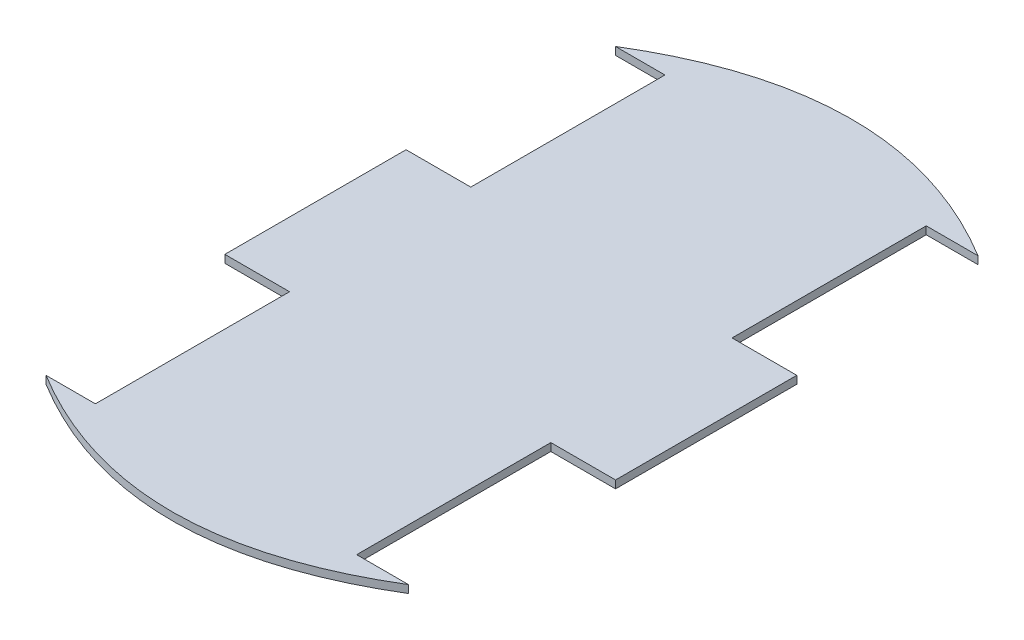
ISO-10303-21;
HEADER;
FILE_DESCRIPTION(('STEP AP214'),'2;1');
FILE_NAME('part.step','',(''),(''),'','','');
FILE_SCHEMA(('AUTOMOTIVE_DESIGN { 1 0 10303 214 1 1 1 1 }'));
ENDSEC;
DATA;
#1=APPLICATION_CONTEXT('core data for automotive mechanical design processes');
#2=APPLICATION_PROTOCOL_DEFINITION('international standard','automotive_design',2000,#1);
#3=PRODUCT_CONTEXT('',#1,'mechanical');
#4=PRODUCT('Part','Part','',(#3));
#5=PRODUCT_RELATED_PRODUCT_CATEGORY('part','',(#4));
#6=PRODUCT_DEFINITION_FORMATION('','',#4);
#7=PRODUCT_DEFINITION_CONTEXT('part definition',#1,'design');
#8=PRODUCT_DEFINITION('design','',#6,#7);
#9=PRODUCT_DEFINITION_SHAPE('','',#8);
#10=(LENGTH_UNIT() NAMED_UNIT(*) SI_UNIT(.MILLI.,.METRE.));
#11=(NAMED_UNIT(*) PLANE_ANGLE_UNIT() SI_UNIT($,.RADIAN.));
#12=(NAMED_UNIT(*) SI_UNIT($,.STERADIAN.) SOLID_ANGLE_UNIT());
#13=UNCERTAINTY_MEASURE_WITH_UNIT(LENGTH_MEASURE(1.E-05),#10,'distance_accuracy_value','');
#14=(GEOMETRIC_REPRESENTATION_CONTEXT(3) GLOBAL_UNCERTAINTY_ASSIGNED_CONTEXT((#13)) GLOBAL_UNIT_ASSIGNED_CONTEXT((#10,
#11,#12)) REPRESENTATION_CONTEXT('',''));
#15=CARTESIAN_POINT('',(0.,0.,0.));
#16=DIRECTION('',(0.,0.,1.));
#17=DIRECTION('',(1.,0.,0.));
#18=AXIS2_PLACEMENT_3D('',#15,#16,#17);
#19=CARTESIAN_POINT('',(-49.9877444634675,3.,0.));
#20=DIRECTION('',(0.,0.,1.));
#21=DIRECTION('',(1.,0.,0.));
#22=AXIS2_PLACEMENT_3D('',#19,#20,#21);
#23=PLANE('',#22);
#24=DIRECTION('',(-1.,0.,0.));
#25=VECTOR('',#24,1.);
#26=CARTESIAN_POINT('',(-49.9877444634675,0.,0.));
#27=LINE('',#26,#25);
#28=CARTESIAN_POINT('',(-49.9877444634675,0.,0.));
#29=VERTEX_POINT('',#28);
#30=CARTESIAN_POINT('',(-74.9877444634675,0.,0.));
#31=VERTEX_POINT('',#30);
#32=EDGE_CURVE('E186',#29,#31,#27,.T.);
#33=ORIENTED_EDGE('',*,*,#32,.T.);
#34=DIRECTION('',(0.,-1.,0.));
#35=VECTOR('',#34,1.);
#36=CARTESIAN_POINT('',(-74.9877444634675,3.,0.));
#37=LINE('',#36,#35);
#38=CARTESIAN_POINT('',(-74.9877444634675,3.,0.));
#39=VERTEX_POINT('',#38);
#40=EDGE_CURVE('E11',#39,#31,#37,.T.);
#41=ORIENTED_EDGE('',*,*,#40,.F.);
#42=DIRECTION('',(-1.,0.,0.));
#43=VECTOR('',#42,1.);
#44=CARTESIAN_POINT('',(-49.9877444634675,3.,0.));
#45=LINE('',#44,#43);
#46=CARTESIAN_POINT('',(-49.9877444634675,3.,0.));
#47=VERTEX_POINT('',#46);
#48=EDGE_CURVE('E226',#47,#39,#45,.T.);
#49=ORIENTED_EDGE('',*,*,#48,.F.);
#50=DIRECTION('',(0.,-1.,0.));
#51=VECTOR('',#50,1.);
#52=CARTESIAN_POINT('',(-49.9877444634675,3.,0.));
#53=LINE('',#52,#51);
#54=EDGE_CURVE('E179',#47,#29,#53,.T.);
#55=ORIENTED_EDGE('',*,*,#54,.T.);
#56=EDGE_LOOP('',(#33,#41,#49,#55));
#57=FACE_BOUND('',#56,.T.);
#58=ADVANCED_FACE('F39',(#57),#23,.F.);
#59=CARTESIAN_POINT('',(-74.9877444634675,3.,0.));
#60=DIRECTION('',(1.,0.,0.));
#61=DIRECTION('',(0.,0.,-1.));
#62=AXIS2_PLACEMENT_3D('',#59,#60,#61);
#63=PLANE('',#62);
#64=DIRECTION('',(0.,0.,1.));
#65=VECTOR('',#64,1.);
#66=CARTESIAN_POINT('',(-74.9877444634675,0.,0.));
#67=LINE('',#66,#65);
#68=CARTESIAN_POINT('',(-74.9877444634675,0.,70.));
#69=VERTEX_POINT('',#68);
#70=EDGE_CURVE('E189',#31,#69,#67,.T.);
#71=ORIENTED_EDGE('',*,*,#70,.T.);
#72=DIRECTION('',(0.,-1.,0.));
#73=VECTOR('',#72,1.);
#74=CARTESIAN_POINT('',(-74.9877444634675,3.,70.));
#75=LINE('',#74,#73);
#76=CARTESIAN_POINT('',(-74.9877444634675,3.,70.));
#77=VERTEX_POINT('',#76);
#78=EDGE_CURVE('E47',#77,#69,#75,.T.);
#79=ORIENTED_EDGE('',*,*,#78,.F.);
#80=DIRECTION('',(0.,0.,1.));
#81=VECTOR('',#80,1.);
#82=CARTESIAN_POINT('',(-74.9877444634675,3.,0.));
#83=LINE('',#82,#81);
#84=EDGE_CURVE('E122',#39,#77,#83,.T.);
#85=ORIENTED_EDGE('',*,*,#84,.F.);
#86=ORIENTED_EDGE('',*,*,#40,.T.);
#87=EDGE_LOOP('',(#71,#79,#85,#86));
#88=FACE_BOUND('',#87,.T.);
#89=ADVANCED_FACE('F310',(#88),#63,.F.);
#90=CARTESIAN_POINT('',(-49.9877444634675,3.,70.));
#91=DIRECTION('',(0.,0.,-1.));
#92=DIRECTION('',(-1.,0.,0.));
#93=AXIS2_PLACEMENT_3D('',#90,#91,#92);
#94=PLANE('',#93);
#95=DIRECTION('',(1.,0.,0.));
#96=VECTOR('',#95,1.);
#97=CARTESIAN_POINT('',(-49.9877444634675,0.,70.));
#98=LINE('',#97,#96);
#99=CARTESIAN_POINT('',(-49.9877444634675,0.,70.));
#100=VERTEX_POINT('',#99);
#101=EDGE_CURVE('E191',#69,#100,#98,.T.);
#102=ORIENTED_EDGE('',*,*,#101,.T.);
#103=DIRECTION('',(0.,-1.,0.));
#104=VECTOR('',#103,1.);
#105=CARTESIAN_POINT('',(-49.9877444634675,3.,70.));
#106=LINE('',#105,#104);
#107=CARTESIAN_POINT('',(-49.9877444634675,3.,70.));
#108=VERTEX_POINT('',#107);
#109=EDGE_CURVE('E257',#108,#100,#106,.T.);
#110=ORIENTED_EDGE('',*,*,#109,.F.);
#111=DIRECTION('',(1.,0.,0.));
#112=VECTOR('',#111,1.);
#113=CARTESIAN_POINT('',(-49.9877444634675,3.,70.));
#114=LINE('',#113,#112);
#115=EDGE_CURVE('E265',#77,#108,#114,.T.);
#116=ORIENTED_EDGE('',*,*,#115,.F.);
#117=ORIENTED_EDGE('',*,*,#78,.T.);
#118=EDGE_LOOP('',(#102,#110,#116,#117));
#119=FACE_BOUND('',#118,.T.);
#120=ADVANCED_FACE('F263',(#119),#94,.F.);
#121=CARTESIAN_POINT('',(-49.9877444634675,3.,70.));
#122=DIRECTION('',(1.,0.,0.));
#123=DIRECTION('',(0.,0.,-1.));
#124=AXIS2_PLACEMENT_3D('',#121,#122,#123);
#125=PLANE('',#124);
#126=DIRECTION('',(0.,0.,1.));
#127=VECTOR('',#126,1.);
#128=CARTESIAN_POINT('',(-49.9877444634675,0.,70.));
#129=LINE('',#128,#127);
#130=CARTESIAN_POINT('',(-49.9877444634675,0.,145.));
#131=VERTEX_POINT('',#130);
#132=EDGE_CURVE('E193',#100,#131,#129,.T.);
#133=ORIENTED_EDGE('',*,*,#132,.T.);
#134=DIRECTION('',(0.,-1.,0.));
#135=VECTOR('',#134,1.);
#136=CARTESIAN_POINT('',(-49.9877444634675,3.,145.));
#137=LINE('',#136,#135);
#138=CARTESIAN_POINT('',(-49.9877444634675,3.,145.));
#139=VERTEX_POINT('',#138);
#140=EDGE_CURVE('E254',#139,#131,#137,.T.);
#141=ORIENTED_EDGE('',*,*,#140,.F.);
#142=DIRECTION('',(0.,0.,1.));
#143=VECTOR('',#142,1.);
#144=CARTESIAN_POINT('',(-49.9877444634675,3.,70.));
#145=LINE('',#144,#143);
#146=EDGE_CURVE('E283',#108,#139,#145,.T.);
#147=ORIENTED_EDGE('',*,*,#146,.F.);
#148=ORIENTED_EDGE('',*,*,#109,.T.);
#149=EDGE_LOOP('',(#133,#141,#147,#148));
#150=FACE_BOUND('',#149,.T.);
#151=ADVANCED_FACE('F274',(#150),#125,.F.);
#152=CARTESIAN_POINT('',(-49.9877444634675,3.,145.));
#153=DIRECTION('',(0.,0.,1.));
#154=DIRECTION('',(1.,0.,0.));
#155=AXIS2_PLACEMENT_3D('',#152,#153,#154);
#156=PLANE('',#155);
#157=DIRECTION('',(-1.,0.,0.));
#158=VECTOR('',#157,1.);
#159=CARTESIAN_POINT('',(-49.9877444634675,0.,145.));
#160=LINE('',#159,#158);
#161=CARTESIAN_POINT('',(-69.0640593370395,0.,145.));
#162=VERTEX_POINT('',#161);
#163=EDGE_CURVE('E195',#131,#162,#160,.T.);
#164=ORIENTED_EDGE('',*,*,#163,.T.);
#165=DIRECTION('',(0.,-1.,0.));
#166=VECTOR('',#165,1.);
#167=CARTESIAN_POINT('',(-69.0640593370395,3.,145.));
#168=LINE('',#167,#166);
#169=CARTESIAN_POINT('',(-69.0640593370395,3.,145.));
#170=VERTEX_POINT('',#169);
#171=EDGE_CURVE('E251',#170,#162,#168,.T.);
#172=ORIENTED_EDGE('',*,*,#171,.F.);
#173=DIRECTION('',(-1.,0.,0.));
#174=VECTOR('',#173,1.);
#175=CARTESIAN_POINT('',(-49.9877444634675,3.,145.));
#176=LINE('',#175,#174);
#177=EDGE_CURVE('E280',#139,#170,#176,.T.);
#178=ORIENTED_EDGE('',*,*,#177,.F.);
#179=ORIENTED_EDGE('',*,*,#140,.T.);
#180=EDGE_LOOP('',(#164,#172,#178,#179));
#181=FACE_BOUND('',#180,.T.);
#182=ADVANCED_FACE('F278',(#181),#156,.F.);
#183=CARTESIAN_POINT('',(-69.0640593370395,3.,145.));
#184=CARTESIAN_POINT('',(0.777424166106229,3.,187.582810978244));
#185=CARTESIAN_POINT('',(70.9359406629605,3.,145.));
#186=B_SPLINE_CURVE_WITH_KNOTS('',2,(#183,#184,#185),.UNSPECIFIED.,.F.,.F.,(3,3),(0.,1.),.UNSPECIFIED.);
#187=DIRECTION('',(0.,-1.,0.));
#188=VECTOR('',#187,1.);
#189=SURFACE_OF_LINEAR_EXTRUSION('',#186,#188);
#190=CARTESIAN_POINT('',(-69.0640593370395,0.,145.));
#191=CARTESIAN_POINT('',(0.777424166106229,0.,187.582810978244));
#192=CARTESIAN_POINT('',(70.9359406629605,0.,145.));
#193=B_SPLINE_CURVE_WITH_KNOTS('',2,(#190,#191,#192),.UNSPECIFIED.,.F.,.F.,(3,3),(0.,1.),.UNSPECIFIED.);
#194=CARTESIAN_POINT('',(70.9359406629605,0.,145.));
#195=VERTEX_POINT('',#194);
#196=EDGE_CURVE('E197',#162,#195,#193,.T.);
#197=ORIENTED_EDGE('',*,*,#196,.T.);
#198=DIRECTION('',(0.,-1.,0.));
#199=VECTOR('',#198,1.);
#200=CARTESIAN_POINT('',(70.9359406629605,3.,145.));
#201=LINE('',#200,#199);
#202=CARTESIAN_POINT('',(70.9359406629605,3.,145.));
#203=VERTEX_POINT('',#202);
#204=EDGE_CURVE('E248',#203,#195,#201,.T.);
#205=ORIENTED_EDGE('',*,*,#204,.F.);
#206=EDGE_CURVE('E282',#170,#203,#186,.T.);
#207=ORIENTED_EDGE('',*,*,#206,.F.);
#208=ORIENTED_EDGE('',*,*,#171,.T.);
#209=EDGE_LOOP('',(#197,#205,#207,#208));
#210=FACE_BOUND('',#209,.T.);
#211=ADVANCED_FACE('F298',(#210),#189,.F.);
#212=CARTESIAN_POINT('',(50.9359406629605,3.,145.));
#213=DIRECTION('',(0.,0.,1.));
#214=DIRECTION('',(1.,0.,0.));
#215=AXIS2_PLACEMENT_3D('',#212,#213,#214);
#216=PLANE('',#215);
#217=DIRECTION('',(-1.,0.,0.));
#218=VECTOR('',#217,1.);
#219=CARTESIAN_POINT('',(50.9359406629605,0.,145.));
#220=LINE('',#219,#218);
#221=CARTESIAN_POINT('',(50.9359406629605,0.,145.));
#222=VERTEX_POINT('',#221);
#223=EDGE_CURVE('E201',#195,#222,#220,.T.);
#224=ORIENTED_EDGE('',*,*,#223,.T.);
#225=DIRECTION('',(0.,-1.,0.));
#226=VECTOR('',#225,1.);
#227=CARTESIAN_POINT('',(50.9359406629605,3.,145.));
#228=LINE('',#227,#226);
#229=CARTESIAN_POINT('',(50.9359406629605,3.,145.));
#230=VERTEX_POINT('',#229);
#231=EDGE_CURVE('E245',#230,#222,#228,.T.);
#232=ORIENTED_EDGE('',*,*,#231,.F.);
#233=DIRECTION('',(-1.,0.,0.));
#234=VECTOR('',#233,1.);
#235=CARTESIAN_POINT('',(50.9359406629605,3.,145.));
#236=LINE('',#235,#234);
#237=EDGE_CURVE('E285',#203,#230,#236,.T.);
#238=ORIENTED_EDGE('',*,*,#237,.F.);
#239=ORIENTED_EDGE('',*,*,#204,.T.);
#240=EDGE_LOOP('',(#224,#232,#238,#239));
#241=FACE_BOUND('',#240,.T.);
#242=ADVANCED_FACE('F302',(#241),#216,.F.);
#243=CARTESIAN_POINT('',(50.9359406629605,3.,70.));
#244=DIRECTION('',(-1.,0.,0.));
#245=DIRECTION('',(0.,0.,1.));
#246=AXIS2_PLACEMENT_3D('',#243,#244,#245);
#247=PLANE('',#246);
#248=DIRECTION('',(0.,0.,-1.));
#249=VECTOR('',#248,1.);
#250=CARTESIAN_POINT('',(50.9359406629605,0.,70.));
#251=LINE('',#250,#249);
#252=CARTESIAN_POINT('',(50.9359406629605,0.,70.));
#253=VERTEX_POINT('',#252);
#254=EDGE_CURVE('E206',#222,#253,#251,.T.);
#255=ORIENTED_EDGE('',*,*,#254,.T.);
#256=DIRECTION('',(0.,-1.,0.));
#257=VECTOR('',#256,1.);
#258=CARTESIAN_POINT('',(50.9359406629605,3.,70.));
#259=LINE('',#258,#257);
#260=CARTESIAN_POINT('',(50.9359406629605,3.,70.));
#261=VERTEX_POINT('',#260);
#262=EDGE_CURVE('E242',#261,#253,#259,.T.);
#263=ORIENTED_EDGE('',*,*,#262,.F.);
#264=DIRECTION('',(0.,0.,-1.));
#265=VECTOR('',#264,1.);
#266=CARTESIAN_POINT('',(50.9359406629605,3.,70.));
#267=LINE('',#266,#265);
#268=EDGE_CURVE('E350',#230,#261,#267,.T.);
#269=ORIENTED_EDGE('',*,*,#268,.F.);
#270=ORIENTED_EDGE('',*,*,#231,.T.);
#271=EDGE_LOOP('',(#255,#263,#269,#270));
#272=FACE_BOUND('',#271,.T.);
#273=ADVANCED_FACE('F349',(#272),#247,.F.);
#274=CARTESIAN_POINT('',(50.9359406629605,3.,70.));
#275=DIRECTION('',(0.,0.,-1.));
#276=DIRECTION('',(-1.,0.,0.));
#277=AXIS2_PLACEMENT_3D('',#274,#275,#276);
#278=PLANE('',#277);
#279=DIRECTION('',(1.,0.,0.));
#280=VECTOR('',#279,1.);
#281=CARTESIAN_POINT('',(50.9359406629605,0.,70.));
#282=LINE('',#281,#280);
#283=CARTESIAN_POINT('',(75.9359406629605,0.,70.));
#284=VERTEX_POINT('',#283);
#285=EDGE_CURVE('E208',#253,#284,#282,.T.);
#286=ORIENTED_EDGE('',*,*,#285,.T.);
#287=DIRECTION('',(0.,-1.,0.));
#288=VECTOR('',#287,1.);
#289=CARTESIAN_POINT('',(75.9359406629605,3.,70.));
#290=LINE('',#289,#288);
#291=CARTESIAN_POINT('',(75.9359406629605,3.,70.));
#292=VERTEX_POINT('',#291);
#293=EDGE_CURVE('E239',#292,#284,#290,.T.);
#294=ORIENTED_EDGE('',*,*,#293,.F.);
#295=DIRECTION('',(1.,0.,0.));
#296=VECTOR('',#295,1.);
#297=CARTESIAN_POINT('',(50.9359406629605,3.,70.));
#298=LINE('',#297,#296);
#299=EDGE_CURVE('E345',#261,#292,#298,.T.);
#300=ORIENTED_EDGE('',*,*,#299,.F.);
#301=ORIENTED_EDGE('',*,*,#262,.T.);
#302=EDGE_LOOP('',(#286,#294,#300,#301));
#303=FACE_BOUND('',#302,.T.);
#304=ADVANCED_FACE('F344',(#303),#278,.F.);
#305=CARTESIAN_POINT('',(75.9359406629605,3.,0.));
#306=DIRECTION('',(-1.,0.,0.));
#307=DIRECTION('',(0.,0.,1.));
#308=AXIS2_PLACEMENT_3D('',#305,#306,#307);
#309=PLANE('',#308);
#310=DIRECTION('',(0.,0.,-1.));
#311=VECTOR('',#310,1.);
#312=CARTESIAN_POINT('',(75.9359406629605,0.,0.));
#313=LINE('',#312,#311);
#314=CARTESIAN_POINT('',(75.9359406629605,0.,0.));
#315=VERTEX_POINT('',#314);
#316=EDGE_CURVE('E210',#284,#315,#313,.T.);
#317=ORIENTED_EDGE('',*,*,#316,.T.);
#318=DIRECTION('',(0.,-1.,0.));
#319=VECTOR('',#318,1.);
#320=CARTESIAN_POINT('',(75.9359406629605,3.,0.));
#321=LINE('',#320,#319);
#322=CARTESIAN_POINT('',(75.9359406629605,3.,0.));
#323=VERTEX_POINT('',#322);
#324=EDGE_CURVE('E236',#323,#315,#321,.T.);
#325=ORIENTED_EDGE('',*,*,#324,.F.);
#326=DIRECTION('',(0.,0.,-1.));
#327=VECTOR('',#326,1.);
#328=CARTESIAN_POINT('',(75.9359406629605,3.,0.));
#329=LINE('',#328,#327);
#330=EDGE_CURVE('E341',#292,#323,#329,.T.);
#331=ORIENTED_EDGE('',*,*,#330,.F.);
#332=ORIENTED_EDGE('',*,*,#293,.T.);
#333=EDGE_LOOP('',(#317,#325,#331,#332));
#334=FACE_BOUND('',#333,.T.);
#335=ADVANCED_FACE('F338',(#334),#309,.F.);
#336=CARTESIAN_POINT('',(50.9359406629605,3.,0.));
#337=DIRECTION('',(0.,0.,1.));
#338=DIRECTION('',(1.,0.,0.));
#339=AXIS2_PLACEMENT_3D('',#336,#337,#338);
#340=PLANE('',#339);
#341=DIRECTION('',(-1.,0.,0.));
#342=VECTOR('',#341,1.);
#343=CARTESIAN_POINT('',(50.9359406629605,0.,0.));
#344=LINE('',#343,#342);
#345=CARTESIAN_POINT('',(50.9359406629605,0.,0.));
#346=VERTEX_POINT('',#345);
#347=EDGE_CURVE('E212',#315,#346,#344,.T.);
#348=ORIENTED_EDGE('',*,*,#347,.T.);
#349=DIRECTION('',(0.,-1.,0.));
#350=VECTOR('',#349,1.);
#351=CARTESIAN_POINT('',(50.9359406629605,3.,0.));
#352=LINE('',#351,#350);
#353=CARTESIAN_POINT('',(50.9359406629605,3.,0.));
#354=VERTEX_POINT('',#353);
#355=EDGE_CURVE('E233',#354,#346,#352,.T.);
#356=ORIENTED_EDGE('',*,*,#355,.F.);
#357=DIRECTION('',(-1.,0.,0.));
#358=VECTOR('',#357,1.);
#359=CARTESIAN_POINT('',(50.9359406629605,3.,0.));
#360=LINE('',#359,#358);
#361=EDGE_CURVE('E332',#323,#354,#360,.T.);
#362=ORIENTED_EDGE('',*,*,#361,.F.);
#363=ORIENTED_EDGE('',*,*,#324,.T.);
#364=EDGE_LOOP('',(#348,#356,#362,#363));
#365=FACE_BOUND('',#364,.T.);
#366=ADVANCED_FACE('F331',(#365),#340,.F.);
#367=CARTESIAN_POINT('',(50.9359406629605,3.,0.));
#368=DIRECTION('',(-1.,0.,0.));
#369=DIRECTION('',(0.,0.,1.));
#370=AXIS2_PLACEMENT_3D('',#367,#368,#369);
#371=PLANE('',#370);
#372=DIRECTION('',(0.,0.,-1.));
#373=VECTOR('',#372,1.);
#374=CARTESIAN_POINT('',(50.9359406629605,0.,0.));
#375=LINE('',#374,#373);
#376=CARTESIAN_POINT('',(50.9359406629605,0.,-75.));
#377=VERTEX_POINT('',#376);
#378=EDGE_CURVE('E214',#346,#377,#375,.T.);
#379=ORIENTED_EDGE('',*,*,#378,.T.);
#380=DIRECTION('',(0.,-1.,0.));
#381=VECTOR('',#380,1.);
#382=CARTESIAN_POINT('',(50.9359406629605,3.,-75.));
#383=LINE('',#382,#381);
#384=CARTESIAN_POINT('',(50.9359406629605,3.,-75.));
#385=VERTEX_POINT('',#384);
#386=EDGE_CURVE('E230',#385,#377,#383,.T.);
#387=ORIENTED_EDGE('',*,*,#386,.F.);
#388=DIRECTION('',(0.,0.,-1.));
#389=VECTOR('',#388,1.);
#390=CARTESIAN_POINT('',(50.9359406629605,3.,0.));
#391=LINE('',#390,#389);
#392=EDGE_CURVE('E327',#354,#385,#391,.T.);
#393=ORIENTED_EDGE('',*,*,#392,.F.);
#394=ORIENTED_EDGE('',*,*,#355,.T.);
#395=EDGE_LOOP('',(#379,#387,#393,#394));
#396=FACE_BOUND('',#395,.T.);
#397=ADVANCED_FACE('F326',(#396),#371,.F.);
#398=CARTESIAN_POINT('',(50.9359406629605,3.,-75.));
#399=DIRECTION('',(0.,0.,-1.));
#400=DIRECTION('',(-1.,0.,0.));
#401=AXIS2_PLACEMENT_3D('',#398,#399,#400);
#402=PLANE('',#401);
#403=DIRECTION('',(1.,0.,0.));
#404=VECTOR('',#403,1.);
#405=CARTESIAN_POINT('',(50.9359406629605,0.,-75.));
#406=LINE('',#405,#404);
#407=CARTESIAN_POINT('',(70.9359406629605,0.,-75.));
#408=VERTEX_POINT('',#407);
#409=EDGE_CURVE('E216',#377,#408,#406,.T.);
#410=ORIENTED_EDGE('',*,*,#409,.T.);
#411=DIRECTION('',(0.,-1.,0.));
#412=VECTOR('',#411,1.);
#413=CARTESIAN_POINT('',(70.9359406629605,3.,-75.));
#414=LINE('',#413,#412);
#415=CARTESIAN_POINT('',(70.9359406629605,3.,-75.));
#416=VERTEX_POINT('',#415);
#417=EDGE_CURVE('E174',#416,#408,#414,.T.);
#418=ORIENTED_EDGE('',*,*,#417,.F.);
#419=DIRECTION('',(1.,0.,0.));
#420=VECTOR('',#419,1.);
#421=CARTESIAN_POINT('',(50.9359406629605,3.,-75.));
#422=LINE('',#421,#420);
#423=EDGE_CURVE('E165',#385,#416,#422,.T.);
#424=ORIENTED_EDGE('',*,*,#423,.F.);
#425=ORIENTED_EDGE('',*,*,#386,.T.);
#426=EDGE_LOOP('',(#410,#418,#424,#425));
#427=FACE_BOUND('',#426,.T.);
#428=ADVANCED_FACE('F322',(#427),#402,.F.);
#429=CARTESIAN_POINT('',(70.9359406629605,3.,-75.));
#430=CARTESIAN_POINT('',(0.777424166106231,3.,-117.582810978244));
#431=CARTESIAN_POINT('',(-69.0640593370395,3.,-75.));
#432=B_SPLINE_CURVE_WITH_KNOTS('',2,(#429,#430,#431),.UNSPECIFIED.,.F.,.F.,(3,3),(0.,1.),.UNSPECIFIED.);
#433=DIRECTION('',(0.,-1.,0.));
#434=VECTOR('',#433,1.);
#435=SURFACE_OF_LINEAR_EXTRUSION('',#432,#434);
#436=CARTESIAN_POINT('',(70.9359406629605,0.,-75.));
#437=CARTESIAN_POINT('',(0.777424166106231,0.,-117.582810978244));
#438=CARTESIAN_POINT('',(-69.0640593370395,0.,-75.));
#439=B_SPLINE_CURVE_WITH_KNOTS('',2,(#436,#437,#438),.UNSPECIFIED.,.F.,.F.,(3,3),(0.,1.),.UNSPECIFIED.);
#440=CARTESIAN_POINT('',(-69.0640593370395,0.,-75.));
#441=VERTEX_POINT('',#440);
#442=EDGE_CURVE('E173',#408,#441,#439,.T.);
#443=ORIENTED_EDGE('',*,*,#442,.T.);
#444=DIRECTION('',(0.,-1.,0.));
#445=VECTOR('',#444,1.);
#446=CARTESIAN_POINT('',(-69.0640593370395,3.,-75.));
#447=LINE('',#446,#445);
#448=CARTESIAN_POINT('',(-69.0640593370395,3.,-75.));
#449=VERTEX_POINT('',#448);
#450=EDGE_CURVE('E170',#449,#441,#447,.T.);
#451=ORIENTED_EDGE('',*,*,#450,.F.);
#452=EDGE_CURVE('E159',#416,#449,#432,.T.);
#453=ORIENTED_EDGE('',*,*,#452,.F.);
#454=ORIENTED_EDGE('',*,*,#417,.T.);
#455=EDGE_LOOP('',(#443,#451,#453,#454));
#456=FACE_BOUND('',#455,.T.);
#457=ADVANCED_FACE('F171',(#456),#435,.F.);
#458=CARTESIAN_POINT('',(-49.9877444634675,3.,-75.));
#459=DIRECTION('',(0.,0.,-1.));
#460=DIRECTION('',(-1.,0.,0.));
#461=AXIS2_PLACEMENT_3D('',#458,#459,#460);
#462=PLANE('',#461);
#463=DIRECTION('',(1.,0.,0.));
#464=VECTOR('',#463,1.);
#465=CARTESIAN_POINT('',(-49.9877444634675,0.,-75.));
#466=LINE('',#465,#464);
#467=CARTESIAN_POINT('',(-49.9877444634675,0.,-75.));
#468=VERTEX_POINT('',#467);
#469=EDGE_CURVE('E108',#441,#468,#466,.T.);
#470=ORIENTED_EDGE('',*,*,#469,.T.);
#471=DIRECTION('',(0.,-1.,0.));
#472=VECTOR('',#471,1.);
#473=CARTESIAN_POINT('',(-49.9877444634675,3.,-75.));
#474=LINE('',#473,#472);
#475=CARTESIAN_POINT('',(-49.9877444634675,3.,-75.));
#476=VERTEX_POINT('',#475);
#477=EDGE_CURVE('E175',#476,#468,#474,.T.);
#478=ORIENTED_EDGE('',*,*,#477,.F.);
#479=DIRECTION('',(1.,0.,0.));
#480=VECTOR('',#479,1.);
#481=CARTESIAN_POINT('',(-49.9877444634675,3.,-75.));
#482=LINE('',#481,#480);
#483=EDGE_CURVE('E163',#449,#476,#482,.T.);
#484=ORIENTED_EDGE('',*,*,#483,.F.);
#485=ORIENTED_EDGE('',*,*,#450,.T.);
#486=EDGE_LOOP('',(#470,#478,#484,#485));
#487=FACE_BOUND('',#486,.T.);
#488=ADVANCED_FACE('F177',(#487),#462,.F.);
#489=CARTESIAN_POINT('',(-49.9877444634675,3.,0.));
#490=DIRECTION('',(1.,0.,0.));
#491=DIRECTION('',(0.,0.,-1.));
#492=AXIS2_PLACEMENT_3D('',#489,#490,#491);
#493=PLANE('',#492);
#494=DIRECTION('',(0.,0.,1.));
#495=VECTOR('',#494,1.);
#496=CARTESIAN_POINT('',(-49.9877444634675,0.,0.));
#497=LINE('',#496,#495);
#498=EDGE_CURVE('E114',#468,#29,#497,.T.);
#499=ORIENTED_EDGE('',*,*,#498,.T.);
#500=ORIENTED_EDGE('',*,*,#54,.F.);
#501=DIRECTION('',(0.,0.,1.));
#502=VECTOR('',#501,1.);
#503=CARTESIAN_POINT('',(-49.9877444634675,3.,0.));
#504=LINE('',#503,#502);
#505=EDGE_CURVE('E55',#476,#47,#504,.T.);
#506=ORIENTED_EDGE('',*,*,#505,.F.);
#507=ORIENTED_EDGE('',*,*,#477,.T.);
#508=EDGE_LOOP('',(#499,#500,#506,#507));
#509=FACE_BOUND('',#508,.T.);
#510=ADVANCED_FACE('F381',(#509),#493,.F.);
#511=CARTESIAN_POINT('',(0.85668241453335,3.,166.291405489122));
#512=DIRECTION('',(0.,-1.,0.));
#513=DIRECTION('',(0.,0.,-1.));
#514=AXIS2_PLACEMENT_3D('',#511,#512,#513);
#515=PLANE('',#514);
#516=ORIENTED_EDGE('',*,*,#48,.T.);
#517=ORIENTED_EDGE('',*,*,#84,.T.);
#518=ORIENTED_EDGE('',*,*,#115,.T.);
#519=ORIENTED_EDGE('',*,*,#146,.T.);
#520=ORIENTED_EDGE('',*,*,#177,.T.);
#521=ORIENTED_EDGE('',*,*,#206,.T.);
#522=ORIENTED_EDGE('',*,*,#237,.T.);
#523=ORIENTED_EDGE('',*,*,#268,.T.);
#524=ORIENTED_EDGE('',*,*,#299,.T.);
#525=ORIENTED_EDGE('',*,*,#330,.T.);
#526=ORIENTED_EDGE('',*,*,#361,.T.);
#527=ORIENTED_EDGE('',*,*,#392,.T.);
#528=ORIENTED_EDGE('',*,*,#423,.T.);
#529=ORIENTED_EDGE('',*,*,#452,.T.);
#530=ORIENTED_EDGE('',*,*,#483,.T.);
#531=ORIENTED_EDGE('',*,*,#505,.T.);
#532=EDGE_LOOP('',(#516,#517,#518,#519,#520,#521,#522,#523,#524,#525,#526,#527,#528,#529,#530,#531));
#533=FACE_BOUND('',#532,.T.);
#534=ADVANCED_FACE('F161',(#533),#515,.F.);
#535=CARTESIAN_POINT('',(0.85668241453335,0.,166.291405489122));
#536=DIRECTION('',(0.,-1.,0.));
#537=DIRECTION('',(0.,0.,-1.));
#538=AXIS2_PLACEMENT_3D('',#535,#536,#537);
#539=PLANE('',#538);
#540=ORIENTED_EDGE('',*,*,#32,.F.);
#541=ORIENTED_EDGE('',*,*,#498,.F.);
#542=ORIENTED_EDGE('',*,*,#469,.F.);
#543=ORIENTED_EDGE('',*,*,#442,.F.);
#544=ORIENTED_EDGE('',*,*,#409,.F.);
#545=ORIENTED_EDGE('',*,*,#378,.F.);
#546=ORIENTED_EDGE('',*,*,#347,.F.);
#547=ORIENTED_EDGE('',*,*,#316,.F.);
#548=ORIENTED_EDGE('',*,*,#285,.F.);
#549=ORIENTED_EDGE('',*,*,#254,.F.);
#550=ORIENTED_EDGE('',*,*,#223,.F.);
#551=ORIENTED_EDGE('',*,*,#196,.F.);
#552=ORIENTED_EDGE('',*,*,#163,.F.);
#553=ORIENTED_EDGE('',*,*,#132,.F.);
#554=ORIENTED_EDGE('',*,*,#101,.F.);
#555=ORIENTED_EDGE('',*,*,#70,.F.);
#556=EDGE_LOOP('',(#540,#541,#542,#543,#544,#545,#546,#547,#548,#549,#550,#551,#552,#553,#554,#555));
#557=FACE_BOUND('',#556,.T.);
#558=ADVANCED_FACE('F269',(#557),#539,.T.);
#559=CLOSED_SHELL('',(#58,#89,#120,#151,#182,#211,#242,#273,#304,#335,#366,#397,#428,#457,#488,
#510,#534,#558));
#560=MANIFOLD_SOLID_BREP('B2',#559);
#561=ADVANCED_BREP_SHAPE_REPRESENTATION('',(#18,#560),#14);
#562=SHAPE_DEFINITION_REPRESENTATION(#9,#561);
ENDSEC;
END-ISO-10303-21;
